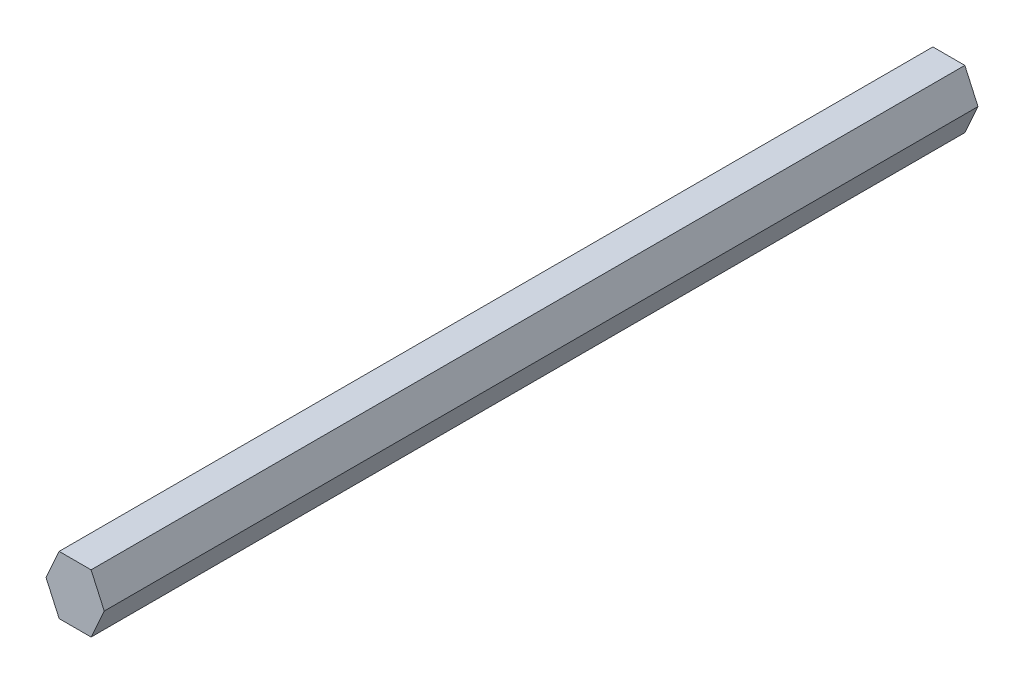
ISO-10303-21;
HEADER;
FILE_DESCRIPTION(('STEP AP214'),'2;1');
FILE_NAME('part.step','',(''),(''),'','','');
FILE_SCHEMA(('AUTOMOTIVE_DESIGN { 1 0 10303 214 1 1 1 1 }'));
ENDSEC;
DATA;
#1=APPLICATION_CONTEXT('core data for automotive mechanical design processes');
#2=APPLICATION_PROTOCOL_DEFINITION('international standard','automotive_design',2000,#1);
#3=PRODUCT_CONTEXT('',#1,'mechanical');
#4=PRODUCT('Part','Part','',(#3));
#5=PRODUCT_RELATED_PRODUCT_CATEGORY('part','',(#4));
#6=PRODUCT_DEFINITION_FORMATION('','',#4);
#7=PRODUCT_DEFINITION_CONTEXT('part definition',#1,'design');
#8=PRODUCT_DEFINITION('design','',#6,#7);
#9=PRODUCT_DEFINITION_SHAPE('','',#8);
#10=(LENGTH_UNIT() NAMED_UNIT(*) SI_UNIT(.MILLI.,.METRE.));
#11=(NAMED_UNIT(*) PLANE_ANGLE_UNIT() SI_UNIT($,.RADIAN.));
#12=(NAMED_UNIT(*) SI_UNIT($,.STERADIAN.) SOLID_ANGLE_UNIT());
#13=UNCERTAINTY_MEASURE_WITH_UNIT(LENGTH_MEASURE(1.E-05),#10,'distance_accuracy_value','');
#14=(GEOMETRIC_REPRESENTATION_CONTEXT(3) GLOBAL_UNCERTAINTY_ASSIGNED_CONTEXT((#13)) GLOBAL_UNIT_ASSIGNED_CONTEXT((#10,
#11,#12)) REPRESENTATION_CONTEXT('',''));
#15=CARTESIAN_POINT('',(0.,0.,0.));
#16=DIRECTION('',(0.,0.,1.));
#17=DIRECTION('',(1.,0.,0.));
#18=AXIS2_PLACEMENT_3D('',#15,#16,#17);
#19=CARTESIAN_POINT('',(3.20065112687496,-0.306438444492937,75.));
#20=DIRECTION('',(-0.911585757795371,0.411109968481232,0.));
#21=DIRECTION('',(-0.411109968481232,-0.911585757795371,0.));
#22=AXIS2_PLACEMENT_3D('',#19,#20,#21);
#23=PLANE('',#22);
#24=DIRECTION('',(0.411109968481232,0.911585757795371,0.));
#25=VECTOR('',#24,1.);
#26=CARTESIAN_POINT('',(3.20065112687496,-0.306438444492937,0.));
#27=LINE('',#26,#25);
#28=CARTESIAN_POINT('',(3.20065112687496,-0.306438444492937,0.));
#29=VERTEX_POINT('',#28);
#30=CARTESIAN_POINT('',(4.32829247006485,2.19396744970292,0.));
#31=VERTEX_POINT('',#30);
#32=EDGE_CURVE('E117',#29,#31,#27,.T.);
#33=ORIENTED_EDGE('',*,*,#32,.T.);
#34=DIRECTION('',(0.,0.,-1.));
#35=VECTOR('',#34,1.);
#36=CARTESIAN_POINT('',(4.32829247006485,2.19396744970292,75.));
#37=LINE('',#36,#35);
#38=CARTESIAN_POINT('',(4.32829247006485,2.19396744970292,75.));
#39=VERTEX_POINT('',#38);
#40=EDGE_CURVE('E11',#39,#31,#37,.T.);
#41=ORIENTED_EDGE('',*,*,#40,.F.);
#42=DIRECTION('',(0.411109968481232,0.911585757795371,0.));
#43=VECTOR('',#42,1.);
#44=CARTESIAN_POINT('',(3.20065112687496,-0.306438444492937,75.));
#45=LINE('',#44,#43);
#46=CARTESIAN_POINT('',(3.20065112687496,-0.306438444492937,75.));
#47=VERTEX_POINT('',#46);
#48=EDGE_CURVE('E127',#47,#39,#45,.T.);
#49=ORIENTED_EDGE('',*,*,#48,.F.);
#50=DIRECTION('',(0.,0.,-1.));
#51=VECTOR('',#50,1.);
#52=CARTESIAN_POINT('',(3.20065112687496,-0.306438444492937,75.));
#53=LINE('',#52,#51);
#54=EDGE_CURVE('E113',#47,#29,#53,.T.);
#55=ORIENTED_EDGE('',*,*,#54,.T.);
#56=EDGE_LOOP('',(#33,#41,#49,#55));
#57=FACE_BOUND('',#56,.T.);
#58=ADVANCED_FACE('F33',(#57),#23,.F.);
#59=CARTESIAN_POINT('',(4.32829247006485,2.19396744970292,75.));
#60=DIRECTION('',(-0.911289799951907,-0.411765589266046,0.));
#61=DIRECTION('',(0.411765589266046,-0.911289799951907,0.));
#62=AXIS2_PLACEMENT_3D('',#59,#60,#61);
#63=PLANE('',#62);
#64=DIRECTION('',(-0.411765589266046,0.911289799951907,0.));
#65=VECTOR('',#64,1.);
#66=CARTESIAN_POINT('',(4.32829247006485,2.19396744970292,0.));
#67=LINE('',#66,#65);
#68=CARTESIAN_POINT('',(3.19885281216821,4.69356155550706,0.));
#69=VERTEX_POINT('',#68);
#70=EDGE_CURVE('E120',#31,#69,#67,.T.);
#71=ORIENTED_EDGE('',*,*,#70,.T.);
#72=DIRECTION('',(0.,0.,-1.));
#73=VECTOR('',#72,1.);
#74=CARTESIAN_POINT('',(3.19885281216821,4.69356155550706,75.));
#75=LINE('',#74,#73);
#76=CARTESIAN_POINT('',(3.19885281216821,4.69356155550706,75.));
#77=VERTEX_POINT('',#76);
#78=EDGE_CURVE('E41',#77,#69,#75,.T.);
#79=ORIENTED_EDGE('',*,*,#78,.F.);
#80=DIRECTION('',(-0.411765589266046,0.911289799951907,0.));
#81=VECTOR('',#80,1.);
#82=CARTESIAN_POINT('',(4.32829247006485,2.19396744970292,75.));
#83=LINE('',#82,#81);
#84=EDGE_CURVE('E86',#39,#77,#83,.T.);
#85=ORIENTED_EDGE('',*,*,#84,.F.);
#86=ORIENTED_EDGE('',*,*,#40,.T.);
#87=EDGE_LOOP('',(#71,#79,#85,#86));
#88=FACE_BOUND('',#87,.T.);
#89=ADVANCED_FACE('F151',(#88),#63,.F.);
#90=CARTESIAN_POINT('',(3.19885281216821,4.69356155550706,75.));
#91=DIRECTION('',(0.,-1.,0.));
#92=DIRECTION('',(1.,0.,0.));
#93=AXIS2_PLACEMENT_3D('',#90,#91,#92);
#94=PLANE('',#93);
#95=DIRECTION('',(-1.,0.,0.));
#96=VECTOR('',#95,1.);
#97=CARTESIAN_POINT('',(3.19885281216821,4.69356155550706,0.));
#98=LINE('',#97,#96);
#99=CARTESIAN_POINT('',(0.455933813254737,4.69356155550706,0.));
#100=VERTEX_POINT('',#99);
#101=EDGE_CURVE('E122',#69,#100,#98,.T.);
#102=ORIENTED_EDGE('',*,*,#101,.T.);
#103=DIRECTION('',(0.,0.,-1.));
#104=VECTOR('',#103,1.);
#105=CARTESIAN_POINT('',(0.455933813254737,4.69356155550706,75.));
#106=LINE('',#105,#104);
#107=CARTESIAN_POINT('',(0.455933813254737,4.69356155550706,75.));
#108=VERTEX_POINT('',#107);
#109=EDGE_CURVE('E108',#108,#100,#106,.T.);
#110=ORIENTED_EDGE('',*,*,#109,.F.);
#111=DIRECTION('',(-1.,0.,0.));
#112=VECTOR('',#111,1.);
#113=CARTESIAN_POINT('',(3.19885281216821,4.69356155550706,75.));
#114=LINE('',#113,#112);
#115=EDGE_CURVE('E99',#77,#108,#114,.T.);
#116=ORIENTED_EDGE('',*,*,#115,.F.);
#117=ORIENTED_EDGE('',*,*,#78,.T.);
#118=EDGE_LOOP('',(#102,#110,#116,#117));
#119=FACE_BOUND('',#118,.T.);
#120=ADVANCED_FACE('F133',(#119),#94,.F.);
#121=CARTESIAN_POINT('',(0.455933813254737,4.69356155550706,75.));
#122=DIRECTION('',(0.911585757795371,-0.411109968481232,0.));
#123=DIRECTION('',(0.411109968481232,0.911585757795371,0.));
#124=AXIS2_PLACEMENT_3D('',#121,#122,#123);
#125=PLANE('',#124);
#126=DIRECTION('',(-0.411109968481232,-0.911585757795371,0.));
#127=VECTOR('',#126,1.);
#128=CARTESIAN_POINT('',(0.455933813254737,4.69356155550706,0.));
#129=LINE('',#128,#127);
#130=CARTESIAN_POINT('',(-0.671707529935153,2.19315566131121,0.));
#131=VERTEX_POINT('',#130);
#132=EDGE_CURVE('E107',#100,#131,#129,.T.);
#133=ORIENTED_EDGE('',*,*,#132,.T.);
#134=DIRECTION('',(0.,0.,-1.));
#135=VECTOR('',#134,1.);
#136=CARTESIAN_POINT('',(-0.671707529935153,2.19315566131121,75.));
#137=LINE('',#136,#135);
#138=CARTESIAN_POINT('',(-0.671707529935153,2.19315566131121,75.));
#139=VERTEX_POINT('',#138);
#140=EDGE_CURVE('E104',#139,#131,#137,.T.);
#141=ORIENTED_EDGE('',*,*,#140,.F.);
#142=DIRECTION('',(-0.411109968481232,-0.911585757795371,0.));
#143=VECTOR('',#142,1.);
#144=CARTESIAN_POINT('',(0.455933813254737,4.69356155550706,75.));
#145=LINE('',#144,#143);
#146=EDGE_CURVE('E93',#108,#139,#145,.T.);
#147=ORIENTED_EDGE('',*,*,#146,.F.);
#148=ORIENTED_EDGE('',*,*,#109,.T.);
#149=EDGE_LOOP('',(#133,#141,#147,#148));
#150=FACE_BOUND('',#149,.T.);
#151=ADVANCED_FACE('F105',(#150),#125,.F.);
#152=CARTESIAN_POINT('',(-0.671707529935153,2.19315566131121,75.));
#153=DIRECTION('',(0.911289799951907,0.411765589266046,0.));
#154=DIRECTION('',(-0.411765589266046,0.911289799951907,0.));
#155=AXIS2_PLACEMENT_3D('',#152,#153,#154);
#156=PLANE('',#155);
#157=DIRECTION('',(0.411765589266046,-0.911289799951907,0.));
#158=VECTOR('',#157,1.);
#159=CARTESIAN_POINT('',(-0.671707529935153,2.19315566131121,0.));
#160=LINE('',#159,#158);
#161=CARTESIAN_POINT('',(0.457732127961485,-0.306438444492937,0.));
#162=VERTEX_POINT('',#161);
#163=EDGE_CURVE('E72',#131,#162,#160,.T.);
#164=ORIENTED_EDGE('',*,*,#163,.T.);
#165=DIRECTION('',(0.,0.,-1.));
#166=VECTOR('',#165,1.);
#167=CARTESIAN_POINT('',(0.457732127961485,-0.306438444492937,75.));
#168=LINE('',#167,#166);
#169=CARTESIAN_POINT('',(0.457732127961485,-0.306438444492937,75.));
#170=VERTEX_POINT('',#169);
#171=EDGE_CURVE('E109',#170,#162,#168,.T.);
#172=ORIENTED_EDGE('',*,*,#171,.F.);
#173=DIRECTION('',(0.411765589266046,-0.911289799951907,0.));
#174=VECTOR('',#173,1.);
#175=CARTESIAN_POINT('',(-0.671707529935153,2.19315566131121,75.));
#176=LINE('',#175,#174);
#177=EDGE_CURVE('E97',#139,#170,#176,.T.);
#178=ORIENTED_EDGE('',*,*,#177,.F.);
#179=ORIENTED_EDGE('',*,*,#140,.T.);
#180=EDGE_LOOP('',(#164,#172,#178,#179));
#181=FACE_BOUND('',#180,.T.);
#182=ADVANCED_FACE('F111',(#181),#156,.F.);
#183=CARTESIAN_POINT('',(0.457732127961485,-0.306438444492937,75.));
#184=DIRECTION('',(0.,1.,0.));
#185=DIRECTION('',(0.,0.,1.));
#186=AXIS2_PLACEMENT_3D('',#183,#184,#185);
#187=PLANE('',#186);
#188=DIRECTION('',(1.,0.,0.));
#189=VECTOR('',#188,1.);
#190=CARTESIAN_POINT('',(0.457732127961485,-0.306438444492937,0.));
#191=LINE('',#190,#189);
#192=EDGE_CURVE('E78',#162,#29,#191,.T.);
#193=ORIENTED_EDGE('',*,*,#192,.T.);
#194=ORIENTED_EDGE('',*,*,#54,.F.);
#195=DIRECTION('',(1.,0.,0.));
#196=VECTOR('',#195,1.);
#197=CARTESIAN_POINT('',(0.457732127961485,-0.306438444492937,75.));
#198=LINE('',#197,#196);
#199=EDGE_CURVE('E49',#170,#47,#198,.T.);
#200=ORIENTED_EDGE('',*,*,#199,.F.);
#201=ORIENTED_EDGE('',*,*,#171,.T.);
#202=EDGE_LOOP('',(#193,#194,#200,#201));
#203=FACE_BOUND('',#202,.T.);
#204=ADVANCED_FACE('F140',(#203),#187,.F.);
#205=CARTESIAN_POINT('',(0.,0.,75.));
#206=DIRECTION('',(0.,0.,1.));
#207=DIRECTION('',(1.,0.,0.));
#208=AXIS2_PLACEMENT_3D('',#205,#206,#207);
#209=PLANE('',#208);
#210=ORIENTED_EDGE('',*,*,#48,.T.);
#211=ORIENTED_EDGE('',*,*,#84,.T.);
#212=ORIENTED_EDGE('',*,*,#115,.T.);
#213=ORIENTED_EDGE('',*,*,#146,.T.);
#214=ORIENTED_EDGE('',*,*,#177,.T.);
#215=ORIENTED_EDGE('',*,*,#199,.T.);
#216=EDGE_LOOP('',(#210,#211,#212,#213,#214,#215));
#217=FACE_BOUND('',#216,.T.);
#218=ADVANCED_FACE('F95',(#217),#209,.T.);
#219=CARTESIAN_POINT('',(0.,0.,0.));
#220=DIRECTION('',(0.,0.,1.));
#221=DIRECTION('',(1.,0.,0.));
#222=AXIS2_PLACEMENT_3D('',#219,#220,#221);
#223=PLANE('',#222);
#224=ORIENTED_EDGE('',*,*,#32,.F.);
#225=ORIENTED_EDGE('',*,*,#192,.F.);
#226=ORIENTED_EDGE('',*,*,#163,.F.);
#227=ORIENTED_EDGE('',*,*,#132,.F.);
#228=ORIENTED_EDGE('',*,*,#101,.F.);
#229=ORIENTED_EDGE('',*,*,#70,.F.);
#230=EDGE_LOOP('',(#224,#225,#226,#227,#228,#229));
#231=FACE_BOUND('',#230,.T.);
#232=ADVANCED_FACE('F136',(#231),#223,.F.);
#233=CLOSED_SHELL('',(#58,#89,#120,#151,#182,#204,#218,#232));
#234=MANIFOLD_SOLID_BREP('B2',#233);
#235=ADVANCED_BREP_SHAPE_REPRESENTATION('',(#18,#234),#14);
#236=SHAPE_DEFINITION_REPRESENTATION(#9,#235);
ENDSEC;
END-ISO-10303-21;
